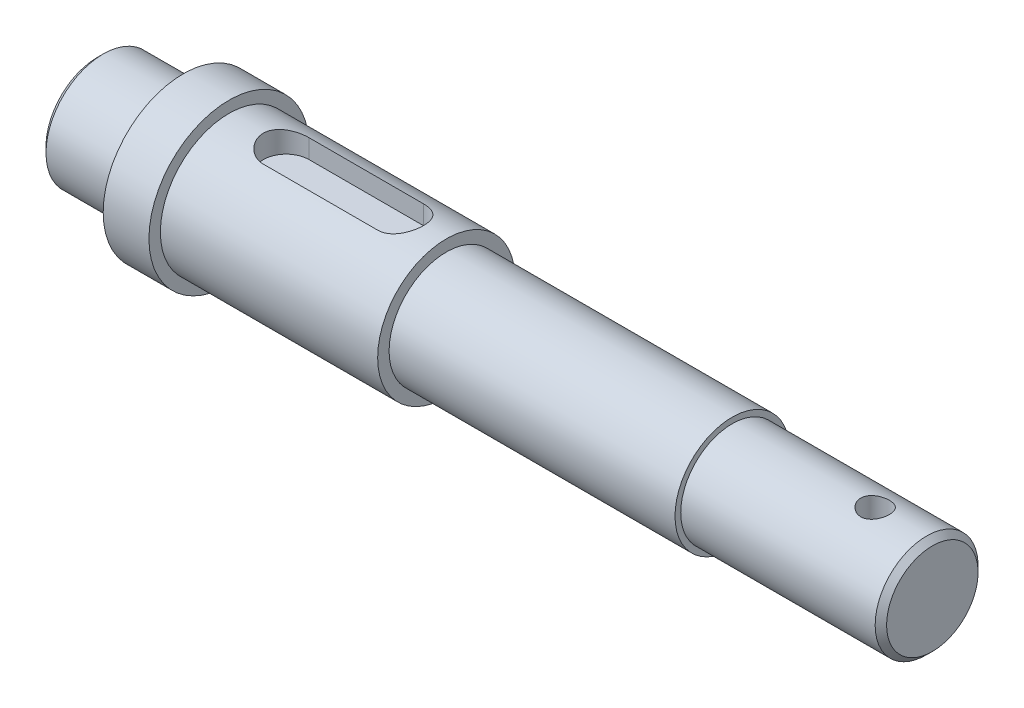
ISO-10303-21;
HEADER;
FILE_DESCRIPTION(('STEP AP214'),'2;1');
FILE_NAME('part.step','',(''),(''),'','','');
FILE_SCHEMA(('AUTOMOTIVE_DESIGN { 1 0 10303 214 1 1 1 1 }'));
ENDSEC;
DATA;
#1=APPLICATION_CONTEXT('core data for automotive mechanical design processes');
#2=APPLICATION_PROTOCOL_DEFINITION('international standard','automotive_design',2000,#1);
#3=PRODUCT_CONTEXT('',#1,'mechanical');
#4=PRODUCT('Part','Part','',(#3));
#5=PRODUCT_RELATED_PRODUCT_CATEGORY('part','',(#4));
#6=PRODUCT_DEFINITION_FORMATION('','',#4);
#7=PRODUCT_DEFINITION_CONTEXT('part definition',#1,'design');
#8=PRODUCT_DEFINITION('design','',#6,#7);
#9=PRODUCT_DEFINITION_SHAPE('','',#8);
#10=(LENGTH_UNIT() NAMED_UNIT(*) SI_UNIT(.MILLI.,.METRE.));
#11=(NAMED_UNIT(*) PLANE_ANGLE_UNIT() SI_UNIT($,.RADIAN.));
#12=(NAMED_UNIT(*) SI_UNIT($,.STERADIAN.) SOLID_ANGLE_UNIT());
#13=UNCERTAINTY_MEASURE_WITH_UNIT(LENGTH_MEASURE(1.E-05),#10,'distance_accuracy_value','');
#14=(GEOMETRIC_REPRESENTATION_CONTEXT(3) GLOBAL_UNCERTAINTY_ASSIGNED_CONTEXT((#13)) GLOBAL_UNIT_ASSIGNED_CONTEXT((#10,
#11,#12)) REPRESENTATION_CONTEXT('',''));
#15=CARTESIAN_POINT('',(0.,0.,0.));
#16=DIRECTION('',(0.,0.,1.));
#17=DIRECTION('',(1.,0.,0.));
#18=AXIS2_PLACEMENT_3D('',#15,#16,#17);
#19=CARTESIAN_POINT('',(-92.2674418604651,0.,0.));
#20=DIRECTION('',(1.,0.,0.));
#21=DIRECTION('',(0.,0.,-1.));
#22=AXIS2_PLACEMENT_3D('',#19,#20,#21);
#23=PLANE('',#22);
#24=CARTESIAN_POINT('',(-92.2674418604651,0.,0.));
#25=DIRECTION('',(1.,0.,0.));
#26=DIRECTION('',(0.,0.,-1.));
#27=AXIS2_PLACEMENT_3D('',#24,#25,#26);
#28=CIRCLE('',#27,9.00000000000002);
#29=CARTESIAN_POINT('',(-92.2674418604651,0.,-9.00000000000002));
#30=VERTEX_POINT('',#29);
#31=EDGE_CURVE('E161',#30,#30,#28,.F.);
#32=ORIENTED_EDGE('',*,*,#31,.T.);
#33=EDGE_LOOP('',(#32));
#34=FACE_BOUND('',#33,.T.);
#35=ADVANCED_FACE('F41',(#34),#23,.F.);
#36=CARTESIAN_POINT('',(-99.4186046511628,0.,0.));
#37=DIRECTION('',(-1.,0.,0.));
#38=DIRECTION('',(0.,0.,1.));
#39=AXIS2_PLACEMENT_3D('',#36,#37,#38);
#40=CYLINDRICAL_SURFACE('',#39,10.);
#41=CARTESIAN_POINT('',(-91.2674418604651,0.,0.));
#42=DIRECTION('',(1.,0.,0.));
#43=DIRECTION('',(0.,0.,-1.));
#44=AXIS2_PLACEMENT_3D('',#41,#42,#43);
#45=CIRCLE('',#44,10.);
#46=CARTESIAN_POINT('',(-91.2674418604651,0.,-10.));
#47=VERTEX_POINT('',#46);
#48=EDGE_CURVE('E165',#47,#47,#45,.T.);
#49=ORIENTED_EDGE('',*,*,#48,.T.);
#50=EDGE_LOOP('',(#49));
#51=FACE_BOUND('',#50,.T.);
#52=CARTESIAN_POINT('',(-77.2674418604651,0.,0.));
#53=DIRECTION('',(-1.,0.,0.));
#54=DIRECTION('',(0.,0.,1.));
#55=AXIS2_PLACEMENT_3D('',#52,#53,#54);
#56=CIRCLE('',#55,10.);
#57=CARTESIAN_POINT('',(-77.2674418604651,0.,10.));
#58=VERTEX_POINT('',#57);
#59=EDGE_CURVE('E149',#58,#58,#56,.T.);
#60=ORIENTED_EDGE('',*,*,#59,.T.);
#61=EDGE_LOOP('',(#60));
#62=FACE_BOUND('',#61,.T.);
#63=ADVANCED_FACE('F207',(#51,#62),#40,.T.);
#64=CARTESIAN_POINT('',(-77.2674418604651,10.,0.));
#65=DIRECTION('',(1.,0.,0.));
#66=DIRECTION('',(0.,0.,-1.));
#67=AXIS2_PLACEMENT_3D('',#64,#65,#66);
#68=PLANE('',#67);
#69=ORIENTED_EDGE('',*,*,#59,.F.);
#70=EDGE_LOOP('',(#69));
#71=FACE_BOUND('',#70,.T.);
#72=CARTESIAN_POINT('',(-77.2674418604651,0.,0.));
#73=DIRECTION('',(-1.,0.,0.));
#74=DIRECTION('',(0.,0.,1.));
#75=AXIS2_PLACEMENT_3D('',#72,#73,#74);
#76=CIRCLE('',#75,14.);
#77=CARTESIAN_POINT('',(-77.2674418604651,0.,14.));
#78=VERTEX_POINT('',#77);
#79=EDGE_CURVE('E145',#78,#78,#76,.T.);
#80=ORIENTED_EDGE('',*,*,#79,.T.);
#81=EDGE_LOOP('',(#80));
#82=FACE_BOUND('',#81,.T.);
#83=ADVANCED_FACE('F213',(#71,#82),#68,.F.);
#84=CARTESIAN_POINT('',(-99.4186046511628,0.,0.));
#85=DIRECTION('',(-1.,0.,0.));
#86=DIRECTION('',(0.,0.,1.));
#87=AXIS2_PLACEMENT_3D('',#84,#85,#86);
#88=CYLINDRICAL_SURFACE('',#87,14.);
#89=ORIENTED_EDGE('',*,*,#79,.F.);
#90=EDGE_LOOP('',(#89));
#91=FACE_BOUND('',#90,.T.);
#92=CARTESIAN_POINT('',(-69.2674418604651,0.,0.));
#93=DIRECTION('',(-1.,0.,0.));
#94=DIRECTION('',(0.,0.,1.));
#95=AXIS2_PLACEMENT_3D('',#92,#93,#94);
#96=CIRCLE('',#95,14.);
#97=CARTESIAN_POINT('',(-69.2674418604651,0.,14.));
#98=VERTEX_POINT('',#97);
#99=EDGE_CURVE('E141',#98,#98,#96,.T.);
#100=ORIENTED_EDGE('',*,*,#99,.T.);
#101=EDGE_LOOP('',(#100));
#102=FACE_BOUND('',#101,.T.);
#103=ADVANCED_FACE('F224',(#91,#102),#88,.T.);
#104=CARTESIAN_POINT('',(-69.2674418604651,14.,0.));
#105=DIRECTION('',(-1.,0.,0.));
#106=DIRECTION('',(0.,0.,1.));
#107=AXIS2_PLACEMENT_3D('',#104,#105,#106);
#108=PLANE('',#107);
#109=ORIENTED_EDGE('',*,*,#99,.F.);
#110=EDGE_LOOP('',(#109));
#111=FACE_BOUND('',#110,.T.);
#112=CARTESIAN_POINT('',(-69.2674418604651,0.,0.));
#113=DIRECTION('',(-1.,0.,0.));
#114=DIRECTION('',(0.,0.,1.));
#115=AXIS2_PLACEMENT_3D('',#112,#113,#114);
#116=CIRCLE('',#115,12.);
#117=CARTESIAN_POINT('',(-69.2674418604651,0.,12.));
#118=VERTEX_POINT('',#117);
#119=EDGE_CURVE('E137',#118,#118,#116,.T.);
#120=ORIENTED_EDGE('',*,*,#119,.T.);
#121=EDGE_LOOP('',(#120));
#122=FACE_BOUND('',#121,.T.);
#123=ADVANCED_FACE('F228',(#111,#122),#108,.F.);
#124=CARTESIAN_POINT('',(-99.4186046511628,0.,0.));
#125=DIRECTION('',(-1.,0.,0.));
#126=DIRECTION('',(0.,0.,1.));
#127=AXIS2_PLACEMENT_3D('',#124,#125,#126);
#128=CYLINDRICAL_SURFACE('',#127,12.);
#129=DIRECTION('',(-1.,0.,0.));
#130=VECTOR('',#129,1.);
#131=CARTESIAN_POINT('',(-99.4186046511628,11.3137084989848,-4.));
#132=LINE('',#131,#130);
#133=CARTESIAN_POINT('',(-59.2674418604651,11.3137084989848,-4.));
#134=VERTEX_POINT('',#133);
#135=CARTESIAN_POINT('',(-39.2674418604651,11.3137084989848,-4.));
#136=VERTEX_POINT('',#135);
#137=EDGE_CURVE('E11',#134,#136,#132,.F.);
#138=ORIENTED_EDGE('',*,*,#137,.T.);
#139=CARTESIAN_POINT('',(-39.2674418604651,11.3137084989848,-4.));
#140=CARTESIAN_POINT('',(-39.1583105359525,11.3136910923705,-4.0000143857665));
#141=CARTESIAN_POINT('',(-39.0491889409844,11.3152871024731,-3.99553419554536));
#142=CARTESIAN_POINT('',(-38.8317921991063,11.3215763859361,-3.97769673248752));
#143=CARTESIAN_POINT('',(-38.7235168316842,11.3262688232103,-3.96434185595522));
#144=CARTESIAN_POINT('',(-38.5088970790978,11.3386032840401,-3.92891935076474));
#145=CARTESIAN_POINT('',(-38.4025479363836,11.3462365576019,-3.90687756421021));
#146=CARTESIAN_POINT('',(-38.1922286307327,11.364201918496,-3.85430689648188));
#147=CARTESIAN_POINT('',(-38.0882585539216,11.3745341033652,-3.82377770857634));
#148=CARTESIAN_POINT('',(-37.781103332921,11.4091190527027,-3.71986482089947));
#149=CARTESIAN_POINT('',(-37.5823552085091,11.4369799021453,-3.63410266896587));
#150=CARTESIAN_POINT('',(-37.2020389621277,11.4991525453998,-3.4322845456982));
#151=CARTESIAN_POINT('',(-37.0204814832321,11.5334682968154,-3.31620997228937));
#152=CARTESIAN_POINT('',(-36.6725732148959,11.6061789182336,-3.05220793355649));
#153=CARTESIAN_POINT('',(-36.5069856319757,11.6446750308563,-2.90330055412141));
#154=CARTESIAN_POINT('',(-36.2026144953515,11.7205540276094,-2.57995313902011));
#155=CARTESIAN_POINT('',(-36.0638357145801,11.7579367125094,-2.40550856651357));
#156=CARTESIAN_POINT('',(-35.8135247014139,11.8285552975691,-2.03041476001126));
#157=CARTESIAN_POINT('',(-35.7027981672039,11.8616574966305,-1.82920040495823));
#158=CARTESIAN_POINT('',(-35.5170726094429,11.9187843500282,-1.40971695235372));
#159=CARTESIAN_POINT('',(-35.4420626718456,11.9428117769099,-1.19145308844236));
#160=CARTESIAN_POINT('',(-35.3324990153036,11.9783628445804,-0.752117395358865));
#161=CARTESIAN_POINT('',(-35.2966287753732,11.9902923605184,-0.531407346429907));
#162=CARTESIAN_POINT('',(-35.262176661241,12.0017443351774,-0.0867958692352811));
#163=CARTESIAN_POINT('',(-35.2635859020777,12.0012697502156,0.137104785886814));
#164=CARTESIAN_POINT('',(-35.3028189557177,11.9882415502496,0.572415361032315));
#165=CARTESIAN_POINT('',(-35.3392122617955,11.9761624577266,0.783970739663753));
#166=CARTESIAN_POINT('',(-35.4450148056774,11.9418784019559,1.19777632834894));
#167=CARTESIAN_POINT('',(-35.5144258741919,11.9196728772387,1.4000260217555));
#168=CARTESIAN_POINT('',(-35.6851267665355,11.8670267992102,1.79261022537109));
#169=CARTESIAN_POINT('',(-35.7868238910712,11.8364817702071,1.98275302130578));
#170=CARTESIAN_POINT('',(-36.0188838164965,11.7703352504572,2.34369935797278));
#171=CARTESIAN_POINT('',(-36.1492544150527,11.7347323851811,2.51449761883744));
#172=CARTESIAN_POINT('',(-36.4421176526495,11.6602518814889,2.84038544309998));
#173=CARTESIAN_POINT('',(-36.605831970764,11.6212989752184,2.99435951335509));
#174=CARTESIAN_POINT('',(-36.9572398938109,11.5458957896576,3.27310303719343));
#175=CARTESIAN_POINT('',(-37.1449412154647,11.5094463215614,3.39786305574725));
#176=CARTESIAN_POINT('',(-37.4421548108423,11.4595759659792,3.56109757745215));
#177=CARTESIAN_POINT('',(-37.5446972652325,11.4436484943195,3.61182358389815));
#178=CARTESIAN_POINT('',(-37.7540068414214,11.4140167075143,3.70440095621127));
#179=CARTESIAN_POINT('',(-37.8607721825407,11.4003114674865,3.74625601636388));
#180=CARTESIAN_POINT('',(-38.0776589470315,11.3755873303494,3.82067426911565));
#181=CARTESIAN_POINT('',(-38.1877765735691,11.3645655126344,3.85324757051516));
#182=CARTESIAN_POINT('',(-38.4106100149124,11.3455648512893,3.90883841588792));
#183=CARTESIAN_POINT('',(-38.5233246184269,11.3375846182867,3.93186032329112));
#184=CARTESIAN_POINT('',(-38.7410843070158,11.3254693235584,3.96661962949784));
#185=CARTESIAN_POINT('',(-38.8459913800437,11.3210705251979,3.97913375141091));
#186=CARTESIAN_POINT('',(-39.0564101931649,11.3151843303776,3.99582494949883));
#187=CARTESIAN_POINT('',(-39.1619209761329,11.3136931771535,4.00001278362333));
#188=CARTESIAN_POINT('',(-39.2674418604651,11.3137084989848,4.));
#189=B_SPLINE_CURVE_WITH_KNOTS('',3,(#139,#140,#141,#142,#143,#144,#145,#146,#147,#148,#149,
#150,#151,#152,#153,#154,#155,#156,#157,#158,#159,#160,#161,#162,#163,#164,#165,#166,#167,#168,
#169,#170,#171,#172,#173,#174,#175,#176,#177,#178,#179,#180,#181,#182,#183,#184,#185,#186,#187,
#188),.UNSPECIFIED.,.F.,.F.,(4,2,2,2,2,2,2,2,2,2,2,2,2,2,2,2,2,2,2,2,2,2,2,2,4),(0.,
0.327273938941727,0.654459544677845,0.980679087086517,1.30691042048862,1.95841627077207,
2.61032287944837,3.28524582541423,3.96028882145702,4.65295094423118,5.34540127175222,
6.01376445600324,6.68196834813282,7.32396236553653,7.96599198323704,8.61646637994584,
9.26711789045787,9.94834778922914,10.6297973968768,10.9759539762202,11.3219661149517,
11.6675999574416,12.0130757272824,12.3299368411189,12.6463882889711),.UNSPECIFIED.);
#190=CARTESIAN_POINT('',(-39.2674418604651,11.3137084989848,4.));
#191=VERTEX_POINT('',#190);
#192=EDGE_CURVE('E178',#136,#191,#189,.T.);
#193=ORIENTED_EDGE('',*,*,#192,.T.);
#194=DIRECTION('',(-1.,0.,0.));
#195=VECTOR('',#194,1.);
#196=CARTESIAN_POINT('',(-99.4186046511628,11.3137084989848,4.));
#197=LINE('',#196,#195);
#198=CARTESIAN_POINT('',(-59.2674418604651,11.3137084989848,4.));
#199=VERTEX_POINT('',#198);
#200=EDGE_CURVE('E51',#191,#199,#197,.T.);
#201=ORIENTED_EDGE('',*,*,#200,.T.);
#202=CARTESIAN_POINT('',(-59.2674418604651,11.3137084989848,4.));
#203=CARTESIAN_POINT('',(-59.3765731849776,11.3136910923705,4.0000143857665));
#204=CARTESIAN_POINT('',(-59.4856947799457,11.3152871024731,3.99553419554536));
#205=CARTESIAN_POINT('',(-59.7030915218239,11.3215763859361,3.97769673248752));
#206=CARTESIAN_POINT('',(-59.8113668892459,11.3262688232103,3.96434185595522));
#207=CARTESIAN_POINT('',(-60.0259866418324,11.3386032840401,3.92891935076474));
#208=CARTESIAN_POINT('',(-60.1323357845466,11.3462365576019,3.90687756421021));
#209=CARTESIAN_POINT('',(-60.3426550901974,11.364201918496,3.85430689648188));
#210=CARTESIAN_POINT('',(-60.4466251670085,11.3745341033652,3.82377770857634));
#211=CARTESIAN_POINT('',(-60.7537803880092,11.4091190527027,3.71986482089947));
#212=CARTESIAN_POINT('',(-60.952528512421,11.4369799021453,3.63410266896587));
#213=CARTESIAN_POINT('',(-61.3328447588025,11.4991525453998,3.4322845456982));
#214=CARTESIAN_POINT('',(-61.514402237698,11.5334682968154,3.31620997228937));
#215=CARTESIAN_POINT('',(-61.8623105060342,11.6061789182336,3.05220793355649));
#216=CARTESIAN_POINT('',(-62.0278980889545,11.6446750308563,2.9033005541214));
#217=CARTESIAN_POINT('',(-62.3322692255787,11.7205540276094,2.57995313902011));
#218=CARTESIAN_POINT('',(-62.4710480063501,11.7579367125094,2.40550856651357));
#219=CARTESIAN_POINT('',(-62.7213590195163,11.8285552975691,2.03041476001126));
#220=CARTESIAN_POINT('',(-62.8320855537263,11.8616574966305,1.82920040495823));
#221=CARTESIAN_POINT('',(-63.0178111114872,11.9187843500282,1.40971695235373));
#222=CARTESIAN_POINT('',(-63.0928210490845,11.9428117769099,1.19145308844236));
#223=CARTESIAN_POINT('',(-63.2023847056265,11.9783628445804,0.752117395358868));
#224=CARTESIAN_POINT('',(-63.2382549455569,11.9902923605184,0.531407346429909));
#225=CARTESIAN_POINT('',(-63.2727070596892,12.0017443351774,0.0867958692352807));
#226=CARTESIAN_POINT('',(-63.2712978188524,12.0012697502156,-0.137104785886816));
#227=CARTESIAN_POINT('',(-63.2320647652124,11.9882415502496,-0.572415361032318));
#228=CARTESIAN_POINT('',(-63.1956714591347,11.9761624577266,-0.783970739663756));
#229=CARTESIAN_POINT('',(-63.0898689152528,11.9418784019559,-1.19777632834894));
#230=CARTESIAN_POINT('',(-63.0204578467382,11.9196728772387,-1.4000260217555));
#231=CARTESIAN_POINT('',(-62.8497569543947,11.8670267992102,-1.79261022537109));
#232=CARTESIAN_POINT('',(-62.7480598298589,11.8364817702071,-1.98275302130577));
#233=CARTESIAN_POINT('',(-62.5159999044337,11.7703352504572,-2.34369935797278));
#234=CARTESIAN_POINT('',(-62.3856293058774,11.7347323851811,-2.51449761883744));
#235=CARTESIAN_POINT('',(-62.0927660682806,11.6602518814889,-2.84038544309998));
#236=CARTESIAN_POINT('',(-61.9290517501661,11.6212989752184,-2.99435951335509));
#237=CARTESIAN_POINT('',(-61.5776438271193,11.5458957896576,-3.27310303719343));
#238=CARTESIAN_POINT('',(-61.3899425054654,11.5094463215614,-3.39786305574726));
#239=CARTESIAN_POINT('',(-61.0927289100879,11.4595759659792,-3.56109757745215));
#240=CARTESIAN_POINT('',(-60.9901864556976,11.4436484943195,-3.61182358389814));
#241=CARTESIAN_POINT('',(-60.7808768795088,11.4140167075143,-3.70440095621127));
#242=CARTESIAN_POINT('',(-60.6741115383895,11.4003114674865,-3.74625601636388));
#243=CARTESIAN_POINT('',(-60.4572247738986,11.3755873303494,-3.82067426911565));
#244=CARTESIAN_POINT('',(-60.347107147361,11.3645655126344,-3.85324757051516));
#245=CARTESIAN_POINT('',(-60.1242737060177,11.3455648512893,-3.90883841588792));
#246=CARTESIAN_POINT('',(-60.0115591025032,11.3375846182867,-3.93186032329112));
#247=CARTESIAN_POINT('',(-59.7937994139143,11.3254693235584,-3.96661962949784));
#248=CARTESIAN_POINT('',(-59.6888923408865,11.3210705251979,-3.97913375141091));
#249=CARTESIAN_POINT('',(-59.4784735277652,11.3151843303776,-3.99582494949883));
#250=CARTESIAN_POINT('',(-59.3729627447972,11.3136931771535,-4.00001278362333));
#251=CARTESIAN_POINT('',(-59.2674418604651,11.3137084989848,-4.));
#252=B_SPLINE_CURVE_WITH_KNOTS('',3,(#202,#203,#204,#205,#206,#207,#208,#209,#210,#211,#212,
#213,#214,#215,#216,#217,#218,#219,#220,#221,#222,#223,#224,#225,#226,#227,#228,#229,#230,#231,
#232,#233,#234,#235,#236,#237,#238,#239,#240,#241,#242,#243,#244,#245,#246,#247,#248,#249,#250,
#251),.UNSPECIFIED.,.F.,.F.,(4,2,2,2,2,2,2,2,2,2,2,2,2,2,2,2,2,2,2,2,2,2,2,2,4),(0.,
0.327273938941734,0.654459544677852,0.98067908708651,1.30691042048862,1.95841627077207,
2.61032287944837,3.28524582541424,3.96028882145702,4.65295094423117,5.34540127175222,
6.01376445600324,6.68196834813282,7.32396236553653,7.96599198323704,8.61646637994583,
9.26711789045787,9.94834778922914,10.6297973968768,10.9759539762202,11.3219661149517,
11.6675999574416,12.0130757272824,12.3299368411189,12.6463882889711),.UNSPECIFIED.);
#253=EDGE_CURVE('E58',#199,#134,#252,.T.);
#254=ORIENTED_EDGE('',*,*,#253,.T.);
#255=EDGE_LOOP('',(#138,#193,#201,#254));
#256=FACE_BOUND('',#255,.T.);
#257=ORIENTED_EDGE('',*,*,#119,.F.);
#258=EDGE_LOOP('',(#257));
#259=FACE_BOUND('',#258,.T.);
#260=CARTESIAN_POINT('',(-31.2674418604651,0.,0.));
#261=DIRECTION('',(-1.,0.,0.));
#262=DIRECTION('',(0.,0.,1.));
#263=AXIS2_PLACEMENT_3D('',#260,#261,#262);
#264=CIRCLE('',#263,12.);
#265=CARTESIAN_POINT('',(-31.2674418604651,0.,12.));
#266=VERTEX_POINT('',#265);
#267=EDGE_CURVE('E133',#266,#266,#264,.T.);
#268=ORIENTED_EDGE('',*,*,#267,.T.);
#269=EDGE_LOOP('',(#268));
#270=FACE_BOUND('',#269,.T.);
#271=ADVANCED_FACE('F232',(#256,#259,#270),#128,.T.);
#272=CARTESIAN_POINT('',(-31.2674418604651,12.,0.));
#273=DIRECTION('',(-1.,0.,0.));
#274=DIRECTION('',(0.,0.,1.));
#275=AXIS2_PLACEMENT_3D('',#272,#273,#274);
#276=PLANE('',#275);
#277=ORIENTED_EDGE('',*,*,#267,.F.);
#278=EDGE_LOOP('',(#277));
#279=FACE_BOUND('',#278,.T.);
#280=CARTESIAN_POINT('',(-31.2674418604651,0.,0.));
#281=DIRECTION('',(-1.,0.,0.));
#282=DIRECTION('',(0.,0.,1.));
#283=AXIS2_PLACEMENT_3D('',#280,#281,#282);
#284=CIRCLE('',#283,10.);
#285=CARTESIAN_POINT('',(-31.2674418604651,0.,10.));
#286=VERTEX_POINT('',#285);
#287=EDGE_CURVE('E129',#286,#286,#284,.T.);
#288=ORIENTED_EDGE('',*,*,#287,.T.);
#289=EDGE_LOOP('',(#288));
#290=FACE_BOUND('',#289,.T.);
#291=ADVANCED_FACE('F237',(#279,#290),#276,.F.);
#292=CARTESIAN_POINT('',(-99.4186046511628,0.,0.));
#293=DIRECTION('',(-1.,0.,0.));
#294=DIRECTION('',(0.,0.,1.));
#295=AXIS2_PLACEMENT_3D('',#292,#293,#294);
#296=CYLINDRICAL_SURFACE('',#295,10.);
#297=ORIENTED_EDGE('',*,*,#287,.F.);
#298=EDGE_LOOP('',(#297));
#299=FACE_BOUND('',#298,.T.);
#300=CARTESIAN_POINT('',(18.7325581395349,0.,0.));
#301=DIRECTION('',(-1.,0.,0.));
#302=DIRECTION('',(0.,0.,1.));
#303=AXIS2_PLACEMENT_3D('',#300,#301,#302);
#304=CIRCLE('',#303,10.);
#305=CARTESIAN_POINT('',(18.7325581395349,0.,10.));
#306=VERTEX_POINT('',#305);
#307=EDGE_CURVE('E125',#306,#306,#304,.T.);
#308=ORIENTED_EDGE('',*,*,#307,.T.);
#309=EDGE_LOOP('',(#308));
#310=FACE_BOUND('',#309,.T.);
#311=ADVANCED_FACE('F351',(#299,#310),#296,.T.);
#312=CARTESIAN_POINT('',(18.7325581395349,10.,0.));
#313=DIRECTION('',(-1.,0.,0.));
#314=DIRECTION('',(0.,0.,1.));
#315=AXIS2_PLACEMENT_3D('',#312,#313,#314);
#316=PLANE('',#315);
#317=ORIENTED_EDGE('',*,*,#307,.F.);
#318=EDGE_LOOP('',(#317));
#319=FACE_BOUND('',#318,.T.);
#320=CARTESIAN_POINT('',(18.7325581395349,0.,0.));
#321=DIRECTION('',(-1.,0.,0.));
#322=DIRECTION('',(0.,0.,1.));
#323=AXIS2_PLACEMENT_3D('',#320,#321,#322);
#324=CIRCLE('',#323,9.);
#325=CARTESIAN_POINT('',(18.7325581395349,0.,9.));
#326=VERTEX_POINT('',#325);
#327=EDGE_CURVE('E121',#326,#326,#324,.T.);
#328=ORIENTED_EDGE('',*,*,#327,.T.);
#329=EDGE_LOOP('',(#328));
#330=FACE_BOUND('',#329,.T.);
#331=ADVANCED_FACE('F204',(#319,#330),#316,.F.);
#332=CARTESIAN_POINT('',(-99.4186046511628,0.,0.));
#333=DIRECTION('',(-1.,0.,0.));
#334=DIRECTION('',(0.,0.,1.));
#335=AXIS2_PLACEMENT_3D('',#332,#333,#334);
#336=CYLINDRICAL_SURFACE('',#335,9.);
#337=CARTESIAN_POINT('',(43.7325581395349,-8.64580823289529,2.5));
#338=CARTESIAN_POINT('',(43.8700450928248,-8.64581037496086,2.49999714996618));
#339=CARTESIAN_POINT('',(44.007561379608,-8.6491236093716,2.48861977425244));
#340=CARTESIAN_POINT('',(44.2786067349661,-8.66197474072459,2.44350693717149));
#341=CARTESIAN_POINT('',(44.4121339948126,-8.67151541786232,2.40976148964066));
#342=CARTESIAN_POINT('',(44.6712404662944,-8.69565935423007,2.32112008680785));
#343=CARTESIAN_POINT('',(44.7968311802886,-8.71025507855494,2.26625559744293));
#344=CARTESIAN_POINT('',(45.0370490615903,-8.74285475062133,2.13703377417485));
#345=CARTESIAN_POINT('',(45.1516751138203,-8.76085904445198,2.06267446056936));
#346=CARTESIAN_POINT('',(45.3698199951178,-8.79879482245345,1.89441531907553));
#347=CARTESIAN_POINT('',(45.4729972571711,-8.81876275539879,1.80008077870937));
#348=CARTESIAN_POINT('',(45.6622889785742,-8.85806239814547,1.59548286960028));
#349=CARTESIAN_POINT('',(45.7484015394999,-8.87739403696071,1.48521773095722));
#350=CARTESIAN_POINT('',(45.9025626006961,-8.91365202741973,1.24950042890599));
#351=CARTESIAN_POINT('',(45.9702687313793,-8.93053038427289,1.12381632761083));
#352=CARTESIAN_POINT('',(46.0834574132946,-8.95956018312964,0.862300362049421));
#353=CARTESIAN_POINT('',(46.1289440441089,-8.97171249276935,0.726470365890888));
#354=CARTESIAN_POINT('',(46.1952890850075,-8.98966318340414,0.452086360205857));
#355=CARTESIAN_POINT('',(46.2167291817962,-8.99561138050703,0.313682975067012));
#356=CARTESIAN_POINT('',(46.2362055961909,-9.00100867384282,0.0351244568787252));
#357=CARTESIAN_POINT('',(46.2342461510916,-9.00045894674934,-0.105030354422779));
#358=CARTESIAN_POINT('',(46.2073825871511,-8.99303086374216,-0.379054247152547));
#359=CARTESIAN_POINT('',(46.1831073755658,-8.98632598075261,-0.512990410045101));
#360=CARTESIAN_POINT('',(46.1133210013024,-8.96754760099034,-0.774807483322484));
#361=CARTESIAN_POINT('',(46.0678085788798,-8.95547378574645,-0.902688034006091));
#362=CARTESIAN_POINT('',(45.9563760589518,-8.9270625060623,-1.15033359179948));
#363=CARTESIAN_POINT('',(45.8902462300106,-8.91068150784286,-1.26999902658788));
#364=CARTESIAN_POINT('',(45.7396185237151,-8.87541221350138,-1.49674457308826));
#365=CARTESIAN_POINT('',(45.6551168068429,-8.85652339359456,-1.60382204684013));
#366=CARTESIAN_POINT('',(45.4668294817577,-8.81753663226074,-1.8061067603823));
#367=CARTESIAN_POINT('',(45.3624963338892,-8.79741936953618,-1.9008012505898));
#368=CARTESIAN_POINT('',(45.1392254644127,-8.75880383152746,-2.07148108085113));
#369=CARTESIAN_POINT('',(45.0202866894165,-8.74030567318147,-2.14746507027558));
#370=CARTESIAN_POINT('',(44.7699934181226,-8.70694013940655,-2.27900238121954));
#371=CARTESIAN_POINT('',(44.638555870229,-8.69209980055975,-2.33440501640979));
#372=CARTESIAN_POINT('',(44.3677145437764,-8.66806022503139,-2.42215297643583));
#373=CARTESIAN_POINT('',(44.228312947285,-8.65885945119346,-2.45450458459976));
#374=CARTESIAN_POINT('',(43.950323625537,-8.64747148287153,-2.49432455486229));
#375=CARTESIAN_POINT('',(43.8118549047259,-8.6450674615786,-2.50256249342185));
#376=CARTESIAN_POINT('',(43.5355161490831,-8.64694988564764,-2.49605092061448));
#377=CARTESIAN_POINT('',(43.3976460461848,-8.65123554925281,-2.48130409524808));
#378=CARTESIAN_POINT('',(43.1294603928436,-8.66580389953324,-2.42992241428478));
#379=CARTESIAN_POINT('',(42.9990464706877,-8.67595686836151,-2.39376059864355));
#380=CARTESIAN_POINT('',(42.7461379124341,-8.70098664146816,-2.30111259188306));
#381=CARTESIAN_POINT('',(42.6236443768153,-8.7158641004892,-2.24462358357885));
#382=CARTESIAN_POINT('',(42.3868627709771,-8.74910362417903,-2.11139571215836));
#383=CARTESIAN_POINT('',(42.2728363684967,-8.76753959855501,-2.03421067264883));
#384=CARTESIAN_POINT('',(42.0590718954592,-8.80564999409988,-1.86232721847474));
#385=CARTESIAN_POINT('',(41.9593367548704,-8.82532466803799,-1.76762522160664));
#386=CARTESIAN_POINT('',(41.7737366689665,-8.86445019939347,-1.55981743646719));
#387=CARTESIAN_POINT('',(41.6884113294671,-8.88387421295946,-1.44622359870981));
#388=CARTESIAN_POINT('',(41.5380341684575,-8.91967402878593,-1.20588311286949));
#389=CARTESIAN_POINT('',(41.4729812727407,-8.93604999253946,-1.07913716217184));
#390=CARTESIAN_POINT('',(41.3656085477115,-8.96380327787492,-0.81697839523326));
#391=CARTESIAN_POINT('',(41.3231169734677,-8.97521823979383,-0.68164010105067));
#392=CARTESIAN_POINT('',(41.2615899660941,-8.99192942838897,-0.405376312895358));
#393=CARTESIAN_POINT('',(41.2425488563913,-8.99722713582853,-0.264452179596266));
#394=CARTESIAN_POINT('',(41.2288438098486,-9.00103042209333,0.0139601523576475));
#395=CARTESIAN_POINT('',(41.2333914324442,-8.99975568986336,0.15140706458965));
#396=CARTESIAN_POINT('',(41.2648867020255,-8.99106088846503,0.423500619727719));
#397=CARTESIAN_POINT('',(41.2918333771049,-8.98364108593446,0.558147383873813));
#398=CARTESIAN_POINT('',(41.3669013631631,-8.96353984091205,0.819784983469305));
#399=CARTESIAN_POINT('',(41.4148507374682,-8.95090116936265,0.946828656281138));
#400=CARTESIAN_POINT('',(41.5304100777661,-8.92167820297651,1.19113920788314));
#401=CARTESIAN_POINT('',(41.5980229729135,-8.90509332036378,1.30840462671538));
#402=CARTESIAN_POINT('',(41.7532300822506,-8.86915397347007,1.53345112172909));
#403=CARTESIAN_POINT('',(41.8413382256036,-8.84973411731035,1.64086726646984));
#404=CARTESIAN_POINT('',(42.0340760699865,-8.81055920809079,1.83965563573725));
#405=CARTESIAN_POINT('',(42.1387102375824,-8.79080406570366,1.931023508681));
#406=CARTESIAN_POINT('',(42.3646026569791,-8.75263553519991,2.09734241907802));
#407=CARTESIAN_POINT('',(42.4862045290668,-8.73426670491594,2.17183796747973));
#408=CARTESIAN_POINT('',(42.7407021267137,-8.70160385709124,2.29922652645139));
#409=CARTESIAN_POINT('',(42.8735910127151,-8.68730739437859,2.35213250833712));
#410=CARTESIAN_POINT('',(43.1269182692732,-8.66621345779749,2.42859494882475));
#411=CARTESIAN_POINT('',(43.2463475450913,-8.65862660680177,2.45530563406018));
#412=CARTESIAN_POINT('',(43.4880297877592,-8.64842338463344,2.49100820491655));
#413=CARTESIAN_POINT('',(43.6102823627473,-8.64580632782193,2.50000253471396));
#414=CARTESIAN_POINT('',(43.7325581395349,-8.64580823289529,2.5));
#415=B_SPLINE_CURVE_WITH_KNOTS('',3,(#337,#338,#339,#340,#341,#342,#343,#344,#345,#346,#347,
#348,#349,#350,#351,#352,#353,#354,#355,#356,#357,#358,#359,#360,#361,#362,#363,#364,#365,#366,
#367,#368,#369,#370,#371,#372,#373,#374,#375,#376,#377,#378,#379,#380,#381,#382,#383,#384,#385,
#386,#387,#388,#389,#390,#391,#392,#393,#394,#395,#396,#397,#398,#399,#400,#401,#402,#403,#404,
#405,#406,#407,#408,#409,#410,#411,#412,#413,#414),.UNSPECIFIED.,.T.,.F.,(4,2,2,2,2,2,2,2,2,2,2,
2,2,2,2,2,2,2,2,2,2,2,2,2,2,2,2,2,2,2,2,2,2,2,2,2,2,2,4),(0.,0.412010791688962,
0.824205648454517,1.23578872527857,1.64741361462617,2.0691389576003,2.49091119062406,
2.92006196750632,3.34913392107924,3.76758631224741,4.18596292931722,4.59289867518082,
4.99985856264056,5.41110133303431,5.82243013129568,6.24742875551484,6.67245804954202,
7.10054057407686,7.52850636571891,7.94265637768505,8.35675799569096,8.76203677700912,
9.16737174834455,9.58226667645633,9.99724654423658,10.4253750626709,10.8534808913584,
11.2782793253857,11.7029749096957,12.1135686473819,12.5241445701257,12.9314203987337,
13.3387569278366,13.7576868945778,14.1767302818544,14.6060087946727,15.0350290098245,
15.4015066296816,15.7679336861631),.UNSPECIFIED.);
#416=CARTESIAN_POINT('',(43.7325581395349,-8.64580823289529,2.5));
#417=VERTEX_POINT('',#416);
#418=EDGE_CURVE('E115',#417,#417,#415,.T.);
#419=ORIENTED_EDGE('',*,*,#418,.T.);
#420=EDGE_LOOP('',(#419));
#421=FACE_BOUND('',#420,.T.);
#422=CARTESIAN_POINT('',(43.7325581395349,8.64580823289529,2.5));
#423=CARTESIAN_POINT('',(43.595071186245,8.64581037496086,2.49999714996618));
#424=CARTESIAN_POINT('',(43.4575548994618,8.6491236093716,2.48861977425244));
#425=CARTESIAN_POINT('',(43.1865095441037,8.66197474072459,2.44350693717149));
#426=CARTESIAN_POINT('',(43.0529822842572,8.67151541786232,2.40976148964066));
#427=CARTESIAN_POINT('',(42.7938758127754,8.69565935423007,2.32112008680785));
#428=CARTESIAN_POINT('',(42.6682850987812,8.71025507855494,2.26625559744293));
#429=CARTESIAN_POINT('',(42.4280672174795,8.74285475062134,2.13703377417484));
#430=CARTESIAN_POINT('',(42.3134411652495,8.76085904445198,2.06267446056935));
#431=CARTESIAN_POINT('',(42.0952962839521,8.79879482245345,1.89441531907552));
#432=CARTESIAN_POINT('',(41.9921190218987,8.81876275539879,1.80008077870936));
#433=CARTESIAN_POINT('',(41.8028273004956,8.85806239814547,1.59548286960027));
#434=CARTESIAN_POINT('',(41.7167147395699,8.87739403696071,1.48521773095722));
#435=CARTESIAN_POINT('',(41.5625536783737,8.91365202741974,1.24950042890599));
#436=CARTESIAN_POINT('',(41.4948475476905,8.93053038427289,1.12381632761083));
#437=CARTESIAN_POINT('',(41.3816588657752,8.95956018312964,0.862300362049422));
#438=CARTESIAN_POINT('',(41.3361722349609,8.97171249276935,0.726470365890889));
#439=CARTESIAN_POINT('',(41.2698271940623,8.98966318340414,0.452086360205858));
#440=CARTESIAN_POINT('',(41.2483870972736,8.99561138050703,0.313682975067012));
#441=CARTESIAN_POINT('',(41.2289106828789,9.00100867384282,0.035124456878725));
#442=CARTESIAN_POINT('',(41.2308701279782,9.00045894674934,-0.105030354422779));
#443=CARTESIAN_POINT('',(41.2577336919187,8.99303086374216,-0.379054247152547));
#444=CARTESIAN_POINT('',(41.282008903504,8.98632598075261,-0.512990410045101));
#445=CARTESIAN_POINT('',(41.3517952777675,8.96754760099034,-0.774807483322484));
#446=CARTESIAN_POINT('',(41.39730770019,8.95547378574645,-0.902688034006091));
#447=CARTESIAN_POINT('',(41.508740220118,8.9270625060623,-1.15033359179948));
#448=CARTESIAN_POINT('',(41.5748700490592,8.91068150784286,-1.26999902658788));
#449=CARTESIAN_POINT('',(41.7254977553547,8.87541221350138,-1.49674457308826));
#450=CARTESIAN_POINT('',(41.8099994722269,8.85652339359456,-1.60382204684013));
#451=CARTESIAN_POINT('',(41.9982867973121,8.81753663226074,-1.8061067603823));
#452=CARTESIAN_POINT('',(42.1026199451806,8.79741936953618,-1.9008012505898));
#453=CARTESIAN_POINT('',(42.3258908146571,8.75880383152746,-2.07148108085113));
#454=CARTESIAN_POINT('',(42.4448295896533,8.74030567318147,-2.14746507027558));
#455=CARTESIAN_POINT('',(42.6951228609472,8.70694013940655,-2.27900238121954));
#456=CARTESIAN_POINT('',(42.8265604088408,8.69209980055975,-2.33440501640979));
#457=CARTESIAN_POINT('',(43.0974017352934,8.66806022503139,-2.42215297643583));
#458=CARTESIAN_POINT('',(43.2368033317848,8.65885945119346,-2.45450458459976));
#459=CARTESIAN_POINT('',(43.5147926535328,8.64747148287153,-2.49432455486229));
#460=CARTESIAN_POINT('',(43.6532613743439,8.6450674615786,-2.50256249342185));
#461=CARTESIAN_POINT('',(43.9296001299868,8.64694988564764,-2.49605092061448));
#462=CARTESIAN_POINT('',(44.067470232885,8.65123554925281,-2.48130409524808));
#463=CARTESIAN_POINT('',(44.3356558862263,8.66580389953324,-2.42992241428478));
#464=CARTESIAN_POINT('',(44.4660698083821,8.67595686836151,-2.39376059864355));
#465=CARTESIAN_POINT('',(44.7189783666358,8.70098664146816,-2.30111259188306));
#466=CARTESIAN_POINT('',(44.8414719022545,8.7158641004892,-2.24462358357885));
#467=CARTESIAN_POINT('',(45.0782535080927,8.74910362417903,-2.11139571215836));
#468=CARTESIAN_POINT('',(45.1922799105731,8.76753959855501,-2.03421067264883));
#469=CARTESIAN_POINT('',(45.4060443836106,8.80564999409988,-1.86232721847474));
#470=CARTESIAN_POINT('',(45.5057795241994,8.82532466803799,-1.76762522160664));
#471=CARTESIAN_POINT('',(45.6913796101034,8.86445019939347,-1.55981743646719));
#472=CARTESIAN_POINT('',(45.7767049496027,8.88387421295946,-1.44622359870981));
#473=CARTESIAN_POINT('',(45.9270821106124,8.91967402878593,-1.20588311286949));
#474=CARTESIAN_POINT('',(45.9921350063291,8.93604999253946,-1.07913716217184));
#475=CARTESIAN_POINT('',(46.0995077313583,8.96380327787492,-0.81697839523326));
#476=CARTESIAN_POINT('',(46.1419993056021,8.97521823979383,-0.68164010105067));
#477=CARTESIAN_POINT('',(46.2035263129757,8.99192942838897,-0.405376312895358));
#478=CARTESIAN_POINT('',(46.2225674226785,8.99722713582853,-0.264452179596266));
#479=CARTESIAN_POINT('',(46.2362724692212,9.00103042209333,0.0139601523576477));
#480=CARTESIAN_POINT('',(46.2317248466256,8.99975568986336,0.151407064589651));
#481=CARTESIAN_POINT('',(46.2002295770443,8.99106088846503,0.42350061972772));
#482=CARTESIAN_POINT('',(46.173282901965,8.98364108593446,0.558147383873813));
#483=CARTESIAN_POINT('',(46.0982149159067,8.96353984091205,0.819784983469305));
#484=CARTESIAN_POINT('',(46.0502655416017,8.95090116936265,0.946828656281137));
#485=CARTESIAN_POINT('',(45.9347062013038,8.92167820297651,1.19113920788314));
#486=CARTESIAN_POINT('',(45.8670933061563,8.90509332036378,1.30840462671538));
#487=CARTESIAN_POINT('',(45.7118861968192,8.86915397347007,1.53345112172909));
#488=CARTESIAN_POINT('',(45.6237780534663,8.84973411731035,1.64086726646984));
#489=CARTESIAN_POINT('',(45.4310402090834,8.81055920809079,1.83965563573725));
#490=CARTESIAN_POINT('',(45.3264060414874,8.79080406570366,1.931023508681));
#491=CARTESIAN_POINT('',(45.1005136220907,8.75263553519991,2.09734241907802));
#492=CARTESIAN_POINT('',(44.978911750003,8.73426670491594,2.17183796747973));
#493=CARTESIAN_POINT('',(44.7244141523562,8.70160385709124,2.29922652645139));
#494=CARTESIAN_POINT('',(44.5915252663548,8.68730739437859,2.35213250833712));
#495=CARTESIAN_POINT('',(44.3381980097966,8.66621345779749,2.42859494882475));
#496=CARTESIAN_POINT('',(44.2187687339785,8.65862660680177,2.45530563406018));
#497=CARTESIAN_POINT('',(43.9770864913106,8.64842338463344,2.49100820491655));
#498=CARTESIAN_POINT('',(43.8548339163225,8.64580632782193,2.50000253471396));
#499=CARTESIAN_POINT('',(43.7325581395349,8.64580823289529,2.5));
#500=B_SPLINE_CURVE_WITH_KNOTS('',3,(#422,#423,#424,#425,#426,#427,#428,#429,#430,#431,#432,
#433,#434,#435,#436,#437,#438,#439,#440,#441,#442,#443,#444,#445,#446,#447,#448,#449,#450,#451,
#452,#453,#454,#455,#456,#457,#458,#459,#460,#461,#462,#463,#464,#465,#466,#467,#468,#469,#470,
#471,#472,#473,#474,#475,#476,#477,#478,#479,#480,#481,#482,#483,#484,#485,#486,#487,#488,#489,
#490,#491,#492,#493,#494,#495,#496,#497,#498,#499),.UNSPECIFIED.,.T.,.F.,(4,2,2,2,2,2,2,2,2,2,2,
2,2,2,2,2,2,2,2,2,2,2,2,2,2,2,2,2,2,2,2,2,2,2,2,2,2,2,4),(0.,0.412010791688962,
0.824205648454517,1.23578872527858,1.64741361462617,2.06913895760031,2.49091119062406,
2.92006196750631,3.34913392107924,3.76758631224741,4.18596292931722,4.59289867518082,
4.99985856264056,5.41110133303431,5.82243013129568,6.24742875551483,6.67245804954202,
7.10054057407686,7.52850636571891,7.94265637768505,8.35675799569096,8.76203677700912,
9.16737174834455,9.58226667645633,9.99724654423658,10.4253750626709,10.8534808913584,
11.2782793253857,11.7029749096957,12.1135686473819,12.5241445701257,12.9314203987337,
13.3387569278366,13.7576868945778,14.1767302818544,14.6060087946727,15.0350290098245,
15.4015066296816,15.7679336861631),.UNSPECIFIED.);
#501=CARTESIAN_POINT('',(43.7325581395349,8.64580823289529,2.5));
#502=VERTEX_POINT('',#501);
#503=EDGE_CURVE('E169',#502,#502,#500,.T.);
#504=ORIENTED_EDGE('',*,*,#503,.T.);
#505=EDGE_LOOP('',(#504));
#506=FACE_BOUND('',#505,.T.);
#507=CARTESIAN_POINT('',(52.7325581395349,0.,0.));
#508=DIRECTION('',(-1.,0.,0.));
#509=DIRECTION('',(0.,0.,1.));
#510=AXIS2_PLACEMENT_3D('',#507,#508,#509);
#511=CIRCLE('',#510,9.);
#512=CARTESIAN_POINT('',(52.7325581395349,0.,9.));
#513=VERTEX_POINT('',#512);
#514=EDGE_CURVE('E153',#513,#513,#511,.T.);
#515=ORIENTED_EDGE('',*,*,#514,.T.);
#516=EDGE_LOOP('',(#515));
#517=FACE_BOUND('',#516,.T.);
#518=ORIENTED_EDGE('',*,*,#327,.F.);
#519=EDGE_LOOP('',(#518));
#520=FACE_BOUND('',#519,.T.);
#521=ADVANCED_FACE('F183',(#421,#506,#517,#520),#336,.T.);
#522=CARTESIAN_POINT('',(53.7325581395349,9.,0.));
#523=DIRECTION('',(-1.,0.,0.));
#524=DIRECTION('',(0.,0.,1.));
#525=AXIS2_PLACEMENT_3D('',#522,#523,#524);
#526=PLANE('',#525);
#527=CARTESIAN_POINT('',(53.7325581395349,0.,0.));
#528=DIRECTION('',(-1.,0.,0.));
#529=DIRECTION('',(0.,0.,1.));
#530=AXIS2_PLACEMENT_3D('',#527,#528,#529);
#531=CIRCLE('',#530,8.00000000000002);
#532=CARTESIAN_POINT('',(53.7325581395349,0.,8.00000000000002));
#533=VERTEX_POINT('',#532);
#534=EDGE_CURVE('E157',#533,#533,#531,.F.);
#535=ORIENTED_EDGE('',*,*,#534,.T.);
#536=EDGE_LOOP('',(#535));
#537=FACE_BOUND('',#536,.T.);
#538=ADVANCED_FACE('F194',(#537),#526,.F.);
#539=CARTESIAN_POINT('',(52.7325581395349,0.,0.));
#540=DIRECTION('',(-1.,0.,0.));
#541=DIRECTION('',(0.,0.,1.));
#542=AXIS2_PLACEMENT_3D('',#539,#540,#541);
#543=CONICAL_SURFACE('',#542,9.,0.785398163397444);
#544=ORIENTED_EDGE('',*,*,#534,.F.);
#545=EDGE_LOOP('',(#544));
#546=FACE_BOUND('',#545,.T.);
#547=ORIENTED_EDGE('',*,*,#514,.F.);
#548=EDGE_LOOP('',(#547));
#549=FACE_BOUND('',#548,.T.);
#550=ADVANCED_FACE('F197',(#546,#549),#543,.T.);
#551=CARTESIAN_POINT('',(-92.2674418604651,0.,0.));
#552=DIRECTION('',(1.,0.,0.));
#553=DIRECTION('',(0.,0.,-1.));
#554=AXIS2_PLACEMENT_3D('',#551,#552,#553);
#555=CONICAL_SURFACE('',#554,9.00000000000002,0.785398163397444);
#556=ORIENTED_EDGE('',*,*,#48,.F.);
#557=EDGE_LOOP('',(#556));
#558=FACE_BOUND('',#557,.T.);
#559=ORIENTED_EDGE('',*,*,#31,.F.);
#560=EDGE_LOOP('',(#559));
#561=FACE_BOUND('',#560,.T.);
#562=ADVANCED_FACE('F44',(#558,#561),#555,.T.);
#563=CARTESIAN_POINT('',(43.7325581395349,-14.,0.));
#564=DIRECTION('',(0.,1.,0.));
#565=DIRECTION('',(0.,0.,1.));
#566=AXIS2_PLACEMENT_3D('',#563,#564,#565);
#567=CYLINDRICAL_SURFACE('',#566,2.5);
#568=ORIENTED_EDGE('',*,*,#503,.F.);
#569=EDGE_LOOP('',(#568));
#570=FACE_BOUND('',#569,.T.);
#571=ORIENTED_EDGE('',*,*,#418,.F.);
#572=EDGE_LOOP('',(#571));
#573=FACE_BOUND('',#572,.T.);
#574=ADVANCED_FACE('F187',(#570,#573),#567,.F.);
#575=CARTESIAN_POINT('',(-59.2674418604651,8.,0.));
#576=DIRECTION('',(0.,1.,0.));
#577=DIRECTION('',(0.,0.,1.));
#578=AXIS2_PLACEMENT_3D('',#575,#576,#577);
#579=CYLINDRICAL_SURFACE('',#578,4.);
#580=DIRECTION('',(0.,1.,0.));
#581=VECTOR('',#580,1.);
#582=CARTESIAN_POINT('',(-59.2674418604651,8.,4.));
#583=LINE('',#582,#581);
#584=CARTESIAN_POINT('',(-59.2674418604651,8.,4.));
#585=VERTEX_POINT('',#584);
#586=EDGE_CURVE('E81',#585,#199,#583,.T.);
#587=ORIENTED_EDGE('',*,*,#586,.F.);
#588=CARTESIAN_POINT('',(-59.2674418604651,8.,0.));
#589=DIRECTION('',(0.,1.,0.));
#590=DIRECTION('',(0.,0.,1.));
#591=AXIS2_PLACEMENT_3D('',#588,#589,#590);
#592=CIRCLE('',#591,4.);
#593=CARTESIAN_POINT('',(-59.2674418604651,8.,-4.));
#594=VERTEX_POINT('',#593);
#595=EDGE_CURVE('E85',#594,#585,#592,.T.);
#596=ORIENTED_EDGE('',*,*,#595,.F.);
#597=DIRECTION('',(0.,1.,0.));
#598=VECTOR('',#597,1.);
#599=CARTESIAN_POINT('',(-59.2674418604651,8.,-4.));
#600=LINE('',#599,#598);
#601=EDGE_CURVE('E112',#594,#134,#600,.T.);
#602=ORIENTED_EDGE('',*,*,#601,.T.);
#603=ORIENTED_EDGE('',*,*,#253,.F.);
#604=EDGE_LOOP('',(#587,#596,#602,#603));
#605=FACE_BOUND('',#604,.T.);
#606=ADVANCED_FACE('F83',(#605),#579,.F.);
#607=CARTESIAN_POINT('',(-59.2674418604651,8.,-4.));
#608=DIRECTION('',(0.,0.,-1.));
#609=DIRECTION('',(-1.,0.,0.));
#610=AXIS2_PLACEMENT_3D('',#607,#608,#609);
#611=PLANE('',#610);
#612=ORIENTED_EDGE('',*,*,#601,.F.);
#613=DIRECTION('',(-1.,0.,0.));
#614=VECTOR('',#613,1.);
#615=CARTESIAN_POINT('',(-59.2674418604651,8.,-4.));
#616=LINE('',#615,#614);
#617=CARTESIAN_POINT('',(-39.2674418604651,8.,-4.));
#618=VERTEX_POINT('',#617);
#619=EDGE_CURVE('E91',#618,#594,#616,.T.);
#620=ORIENTED_EDGE('',*,*,#619,.F.);
#621=DIRECTION('',(0.,1.,0.));
#622=VECTOR('',#621,1.);
#623=CARTESIAN_POINT('',(-39.2674418604651,8.,-4.));
#624=LINE('',#623,#622);
#625=EDGE_CURVE('E116',#618,#136,#624,.T.);
#626=ORIENTED_EDGE('',*,*,#625,.T.);
#627=ORIENTED_EDGE('',*,*,#137,.F.);
#628=EDGE_LOOP('',(#612,#620,#626,#627));
#629=FACE_BOUND('',#628,.T.);
#630=ADVANCED_FACE('F257',(#629),#611,.F.);
#631=CARTESIAN_POINT('',(-39.2674418604651,8.,0.));
#632=DIRECTION('',(0.,1.,0.));
#633=DIRECTION('',(0.,0.,1.));
#634=AXIS2_PLACEMENT_3D('',#631,#632,#633);
#635=CYLINDRICAL_SURFACE('',#634,4.);
#636=ORIENTED_EDGE('',*,*,#625,.F.);
#637=CARTESIAN_POINT('',(-39.2674418604651,8.,0.));
#638=DIRECTION('',(0.,1.,0.));
#639=DIRECTION('',(0.,0.,1.));
#640=AXIS2_PLACEMENT_3D('',#637,#638,#639);
#641=CIRCLE('',#640,4.);
#642=CARTESIAN_POINT('',(-39.2674418604651,8.,4.));
#643=VERTEX_POINT('',#642);
#644=EDGE_CURVE('E101',#643,#618,#641,.T.);
#645=ORIENTED_EDGE('',*,*,#644,.F.);
#646=DIRECTION('',(0.,1.,0.));
#647=VECTOR('',#646,1.);
#648=CARTESIAN_POINT('',(-39.2674418604651,8.,4.));
#649=LINE('',#648,#647);
#650=EDGE_CURVE('E90',#643,#191,#649,.T.);
#651=ORIENTED_EDGE('',*,*,#650,.T.);
#652=ORIENTED_EDGE('',*,*,#192,.F.);
#653=EDGE_LOOP('',(#636,#645,#651,#652));
#654=FACE_BOUND('',#653,.T.);
#655=ADVANCED_FACE('F256',(#654),#635,.F.);
#656=CARTESIAN_POINT('',(-59.2674418604651,8.,4.));
#657=DIRECTION('',(0.,0.,1.));
#658=DIRECTION('',(1.,0.,0.));
#659=AXIS2_PLACEMENT_3D('',#656,#657,#658);
#660=PLANE('',#659);
#661=ORIENTED_EDGE('',*,*,#650,.F.);
#662=DIRECTION('',(1.,0.,0.));
#663=VECTOR('',#662,1.);
#664=CARTESIAN_POINT('',(-59.2674418604651,8.,4.));
#665=LINE('',#664,#663);
#666=EDGE_CURVE('E94',#585,#643,#665,.T.);
#667=ORIENTED_EDGE('',*,*,#666,.F.);
#668=ORIENTED_EDGE('',*,*,#586,.T.);
#669=ORIENTED_EDGE('',*,*,#200,.F.);
#670=EDGE_LOOP('',(#661,#667,#668,#669));
#671=FACE_BOUND('',#670,.T.);
#672=ADVANCED_FACE('F95',(#671),#660,.F.);
#673=CARTESIAN_POINT('',(-59.2674418604651,8.,0.));
#674=DIRECTION('',(0.,1.,0.));
#675=DIRECTION('',(0.,0.,1.));
#676=AXIS2_PLACEMENT_3D('',#673,#674,#675);
#677=PLANE('',#676);
#678=ORIENTED_EDGE('',*,*,#595,.T.);
#679=ORIENTED_EDGE('',*,*,#666,.T.);
#680=ORIENTED_EDGE('',*,*,#644,.T.);
#681=ORIENTED_EDGE('',*,*,#619,.T.);
#682=EDGE_LOOP('',(#678,#679,#680,#681));
#683=FACE_BOUND('',#682,.T.);
#684=ADVANCED_FACE('F103',(#683),#677,.T.);
#685=CLOSED_SHELL('',(#35,#63,#83,#103,#123,#271,#291,#311,#331,#521,#538,#550,#562,#574,#606,
#630,#655,#672,#684));
#686=MANIFOLD_SOLID_BREP('B2',#685);
#687=ADVANCED_BREP_SHAPE_REPRESENTATION('',(#18,#686),#14);
#688=SHAPE_DEFINITION_REPRESENTATION(#9,#687);
ENDSEC;
END-ISO-10303-21;
